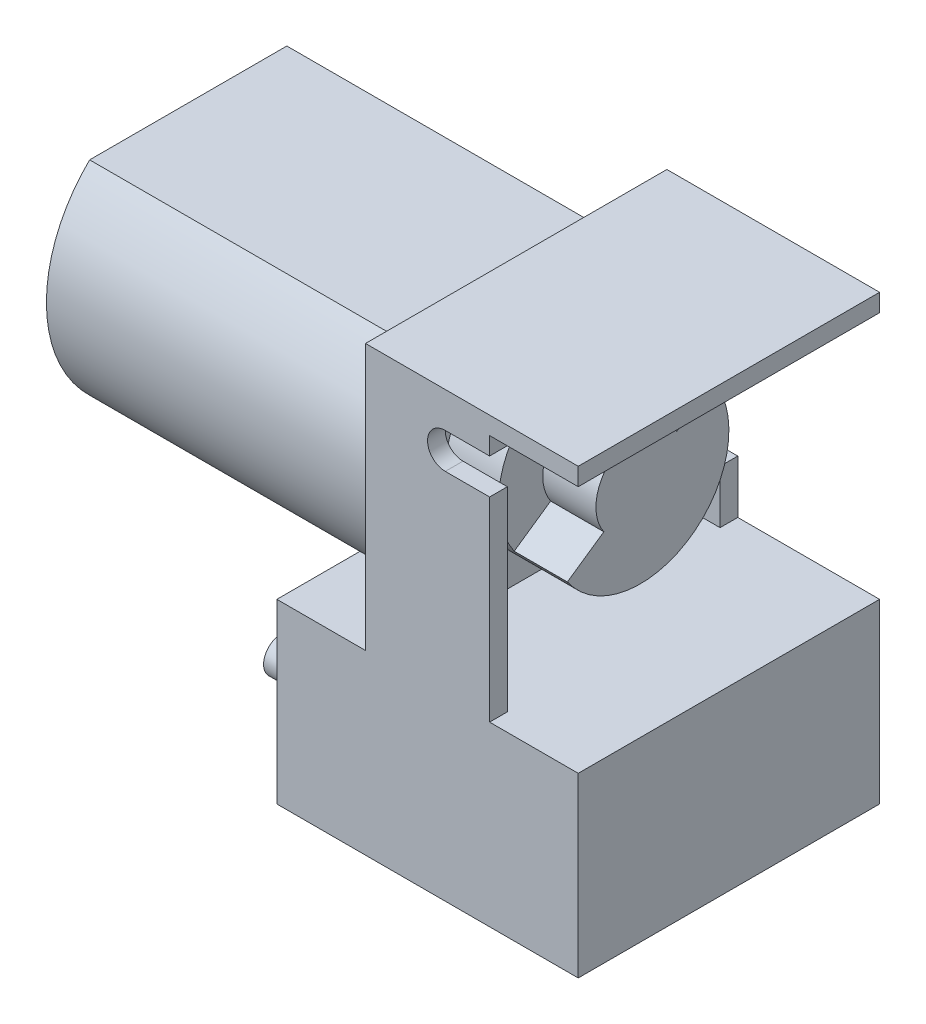
ISO-10303-21;
HEADER;
FILE_DESCRIPTION(('STEP AP214'),'2;1');
FILE_NAME('part.step','',(''),(''),'','','');
FILE_SCHEMA(('AUTOMOTIVE_DESIGN { 1 0 10303 214 1 1 1 1 }'));
ENDSEC;
DATA;
#1=APPLICATION_CONTEXT('core data for automotive mechanical design processes');
#2=APPLICATION_PROTOCOL_DEFINITION('international standard','automotive_design',2000,#1);
#3=PRODUCT_CONTEXT('',#1,'mechanical');
#4=PRODUCT('Part','Part','',(#3));
#5=PRODUCT_RELATED_PRODUCT_CATEGORY('part','',(#4));
#6=PRODUCT_DEFINITION_FORMATION('','',#4);
#7=PRODUCT_DEFINITION_CONTEXT('part definition',#1,'design');
#8=PRODUCT_DEFINITION('design','',#6,#7);
#9=PRODUCT_DEFINITION_SHAPE('','',#8);
#10=(LENGTH_UNIT() NAMED_UNIT(*) SI_UNIT(.MILLI.,.METRE.));
#11=(NAMED_UNIT(*) PLANE_ANGLE_UNIT() SI_UNIT($,.RADIAN.));
#12=(NAMED_UNIT(*) SI_UNIT($,.STERADIAN.) SOLID_ANGLE_UNIT());
#13=UNCERTAINTY_MEASURE_WITH_UNIT(LENGTH_MEASURE(1.E-05),#10,'distance_accuracy_value','');
#14=(GEOMETRIC_REPRESENTATION_CONTEXT(3) GLOBAL_UNCERTAINTY_ASSIGNED_CONTEXT((#13)) GLOBAL_UNIT_ASSIGNED_CONTEXT((#10,
#11,#12)) REPRESENTATION_CONTEXT('',''));
#15=CARTESIAN_POINT('',(0.,0.,0.));
#16=DIRECTION('',(0.,0.,1.));
#17=DIRECTION('',(1.,0.,0.));
#18=AXIS2_PLACEMENT_3D('',#15,#16,#17);
#19=CARTESIAN_POINT('',(-3.5,20.,8.5));
#20=DIRECTION('',(1.,0.,0.));
#21=DIRECTION('',(0.,1.,0.));
#22=AXIS2_PLACEMENT_3D('',#19,#20,#21);
#23=PLANE('',#22);
#24=DIRECTION('',(0.,-1.,0.));
#25=VECTOR('',#24,1.);
#26=CARTESIAN_POINT('',(-3.5,20.,-8.5));
#27=LINE('',#26,#25);
#28=CARTESIAN_POINT('',(-3.5,20.,-8.5));
#29=VERTEX_POINT('',#28);
#30=CARTESIAN_POINT('',(-3.5,5.,-8.5));
#31=VERTEX_POINT('',#30);
#32=EDGE_CURVE('E386',#29,#31,#27,.T.);
#33=ORIENTED_EDGE('',*,*,#32,.T.);
#34=DIRECTION('',(0.,0.,-1.));
#35=VECTOR('',#34,1.);
#36=CARTESIAN_POINT('',(-3.5,5.,8.5));
#37=LINE('',#36,#35);
#38=CARTESIAN_POINT('',(-3.5,5.,8.5));
#39=VERTEX_POINT('',#38);
#40=EDGE_CURVE('E401',#39,#31,#37,.T.);
#41=ORIENTED_EDGE('',*,*,#40,.F.);
#42=DIRECTION('',(0.,-1.,0.));
#43=VECTOR('',#42,1.);
#44=CARTESIAN_POINT('',(-3.5,20.,8.5));
#45=LINE('',#44,#43);
#46=CARTESIAN_POINT('',(-3.5,20.,8.5));
#47=VERTEX_POINT('',#46);
#48=EDGE_CURVE('E365',#47,#39,#45,.T.);
#49=ORIENTED_EDGE('',*,*,#48,.F.);
#50=DIRECTION('',(0.,0.,-1.));
#51=VECTOR('',#50,1.);
#52=CARTESIAN_POINT('',(-3.5,20.,8.5));
#53=LINE('',#52,#51);
#54=EDGE_CURVE('E404',#47,#29,#53,.T.);
#55=ORIENTED_EDGE('',*,*,#54,.T.);
#56=EDGE_LOOP('',(#33,#41,#49,#55));
#57=FACE_BOUND('',#56,.T.);
#58=CARTESIAN_POINT('',(-3.5,12.5,0.));
#59=DIRECTION('',(-1.,0.,0.));
#60=DIRECTION('',(0.,-1.,0.));
#61=AXIS2_PLACEMENT_3D('',#58,#59,#60);
#62=CIRCLE('',#61,8.);
#63=CARTESIAN_POINT('',(-3.5,18.25,-5.56214886532174));
#64=VERTEX_POINT('',#63);
#65=CARTESIAN_POINT('',(-3.5,6.75,-5.56214886532175));
#66=VERTEX_POINT('',#65);
#67=EDGE_CURVE('E248',#64,#66,#62,.T.);
#68=ORIENTED_EDGE('',*,*,#67,.F.);
#69=DIRECTION('',(0.,0.,-1.));
#70=VECTOR('',#69,1.);
#71=CARTESIAN_POINT('',(-3.5,18.25,-5.56214886532174));
#72=LINE('',#71,#70);
#73=CARTESIAN_POINT('',(-3.5,18.25,5.56214886532174));
#74=VERTEX_POINT('',#73);
#75=EDGE_CURVE('E257',#74,#64,#72,.T.);
#76=ORIENTED_EDGE('',*,*,#75,.F.);
#77=CARTESIAN_POINT('',(-3.5,12.5,0.));
#78=DIRECTION('',(-1.,0.,0.));
#79=DIRECTION('',(0.,-1.,0.));
#80=AXIS2_PLACEMENT_3D('',#77,#78,#79);
#81=CIRCLE('',#80,8.);
#82=CARTESIAN_POINT('',(-3.5,6.75,5.56214886532175));
#83=VERTEX_POINT('',#82);
#84=EDGE_CURVE('E267',#83,#74,#81,.T.);
#85=ORIENTED_EDGE('',*,*,#84,.F.);
#86=DIRECTION('',(0.,0.,1.));
#87=VECTOR('',#86,1.);
#88=CARTESIAN_POINT('',(-3.5,6.75,5.56214886532175));
#89=LINE('',#88,#87);
#90=EDGE_CURVE('E62',#66,#83,#89,.T.);
#91=ORIENTED_EDGE('',*,*,#90,.F.);
#92=EDGE_LOOP('',(#68,#76,#85,#91));
#93=FACE_BOUND('',#92,.T.);
#94=ADVANCED_FACE('F39',(#57,#93),#23,.F.);
#95=CARTESIAN_POINT('',(8.5,-5.,8.5));
#96=DIRECTION('',(-1.,0.,0.));
#97=DIRECTION('',(0.,0.,1.));
#98=AXIS2_PLACEMENT_3D('',#95,#96,#97);
#99=PLANE('',#98);
#100=DIRECTION('',(0.,1.,0.));
#101=VECTOR('',#100,1.);
#102=CARTESIAN_POINT('',(8.5,-5.,-8.5));
#103=LINE('',#102,#101);
#104=CARTESIAN_POINT('',(8.5,-5.,-8.5));
#105=VERTEX_POINT('',#104);
#106=CARTESIAN_POINT('',(8.5,5.,-8.5));
#107=VERTEX_POINT('',#106);
#108=EDGE_CURVE('E342',#105,#107,#103,.T.);
#109=ORIENTED_EDGE('',*,*,#108,.T.);
#110=DIRECTION('',(0.,0.,-1.));
#111=VECTOR('',#110,1.);
#112=CARTESIAN_POINT('',(8.5,5.,8.5));
#113=LINE('',#112,#111);
#114=CARTESIAN_POINT('',(8.5,5.,8.5));
#115=VERTEX_POINT('',#114);
#116=EDGE_CURVE('E430',#115,#107,#113,.T.);
#117=ORIENTED_EDGE('',*,*,#116,.F.);
#118=DIRECTION('',(0.,1.,0.));
#119=VECTOR('',#118,1.);
#120=CARTESIAN_POINT('',(8.5,-5.,8.5));
#121=LINE('',#120,#119);
#122=CARTESIAN_POINT('',(8.5,-5.,8.5));
#123=VERTEX_POINT('',#122);
#124=EDGE_CURVE('E343',#123,#115,#121,.T.);
#125=ORIENTED_EDGE('',*,*,#124,.F.);
#126=DIRECTION('',(0.,0.,-1.));
#127=VECTOR('',#126,1.);
#128=CARTESIAN_POINT('',(8.5,-5.,8.5));
#129=LINE('',#128,#127);
#130=EDGE_CURVE('E373',#123,#105,#129,.T.);
#131=ORIENTED_EDGE('',*,*,#130,.T.);
#132=EDGE_LOOP('',(#109,#117,#125,#131));
#133=FACE_BOUND('',#132,.T.);
#134=ADVANCED_FACE('F41',(#133),#99,.F.);
#135=CARTESIAN_POINT('',(8.5,5.,8.5));
#136=DIRECTION('',(0.,-1.,0.));
#137=DIRECTION('',(1.,0.,0.));
#138=AXIS2_PLACEMENT_3D('',#135,#136,#137);
#139=PLANE('',#138);
#140=DIRECTION('',(-1.,0.,0.));
#141=VECTOR('',#140,1.);
#142=CARTESIAN_POINT('',(8.5,5.,-8.5));
#143=LINE('',#142,#141);
#144=CARTESIAN_POINT('',(0.500000000000002,5.,-8.5));
#145=VERTEX_POINT('',#144);
#146=EDGE_CURVE('E376',#107,#145,#143,.T.);
#147=ORIENTED_EDGE('',*,*,#146,.T.);
#148=DIRECTION('',(0.,0.,-1.));
#149=VECTOR('',#148,1.);
#150=CARTESIAN_POINT('',(0.500000000000002,5.,-7.5));
#151=LINE('',#150,#149);
#152=CARTESIAN_POINT('',(0.500000000000002,5.,-7.5));
#153=VERTEX_POINT('',#152);
#154=EDGE_CURVE('E306',#153,#145,#151,.T.);
#155=ORIENTED_EDGE('',*,*,#154,.F.);
#156=DIRECTION('',(-1.,0.,0.));
#157=VECTOR('',#156,1.);
#158=CARTESIAN_POINT('',(-2.5,5.,-7.5));
#159=LINE('',#158,#157);
#160=CARTESIAN_POINT('',(-2.5,5.,-7.5));
#161=VERTEX_POINT('',#160);
#162=EDGE_CURVE('E298',#153,#161,#159,.T.);
#163=ORIENTED_EDGE('',*,*,#162,.T.);
#164=DIRECTION('',(0.,0.,1.));
#165=VECTOR('',#164,1.);
#166=CARTESIAN_POINT('',(-2.5,5.,7.5));
#167=LINE('',#166,#165);
#168=CARTESIAN_POINT('',(-2.5,5.,7.5));
#169=VERTEX_POINT('',#168);
#170=EDGE_CURVE('E322',#161,#169,#167,.T.);
#171=ORIENTED_EDGE('',*,*,#170,.T.);
#172=DIRECTION('',(1.,0.,0.));
#173=VECTOR('',#172,1.);
#174=CARTESIAN_POINT('',(-24.7602916254693,5.,7.5));
#175=LINE('',#174,#173);
#176=CARTESIAN_POINT('',(3.5,5.,7.5));
#177=VERTEX_POINT('',#176);
#178=EDGE_CURVE('E308',#169,#177,#175,.T.);
#179=ORIENTED_EDGE('',*,*,#178,.T.);
#180=DIRECTION('',(0.,0.,-1.));
#181=VECTOR('',#180,1.);
#182=CARTESIAN_POINT('',(3.5,5.,8.5));
#183=LINE('',#182,#181);
#184=CARTESIAN_POINT('',(3.5,5.,8.5));
#185=VERTEX_POINT('',#184);
#186=EDGE_CURVE('E427',#185,#177,#183,.T.);
#187=ORIENTED_EDGE('',*,*,#186,.F.);
#188=DIRECTION('',(-1.,0.,0.));
#189=VECTOR('',#188,1.);
#190=CARTESIAN_POINT('',(8.5,5.,8.5));
#191=LINE('',#190,#189);
#192=EDGE_CURVE('E346',#115,#185,#191,.T.);
#193=ORIENTED_EDGE('',*,*,#192,.F.);
#194=ORIENTED_EDGE('',*,*,#116,.T.);
#195=EDGE_LOOP('',(#147,#155,#163,#171,#179,#187,#193,#194));
#196=FACE_BOUND('',#195,.T.);
#197=ADVANCED_FACE('F503',(#196),#139,.F.);
#198=CARTESIAN_POINT('',(3.5,5.,8.5));
#199=DIRECTION('',(-1.,0.,0.));
#200=DIRECTION('',(0.,-1.,0.));
#201=AXIS2_PLACEMENT_3D('',#198,#199,#200);
#202=PLANE('',#201);
#203=ORIENTED_EDGE('',*,*,#186,.T.);
#204=DIRECTION('',(0.,1.,0.));
#205=VECTOR('',#204,1.);
#206=CARTESIAN_POINT('',(3.5,5.,7.5));
#207=LINE('',#206,#205);
#208=CARTESIAN_POINT('',(3.5,16.,7.5));
#209=VERTEX_POINT('',#208);
#210=EDGE_CURVE('E339',#177,#209,#207,.T.);
#211=ORIENTED_EDGE('',*,*,#210,.T.);
#212=DIRECTION('',(0.,0.,-1.));
#213=VECTOR('',#212,1.);
#214=CARTESIAN_POINT('',(3.5,16.,8.5));
#215=LINE('',#214,#213);
#216=CARTESIAN_POINT('',(3.5,16.,8.5));
#217=VERTEX_POINT('',#216);
#218=EDGE_CURVE('E424',#217,#209,#215,.T.);
#219=ORIENTED_EDGE('',*,*,#218,.F.);
#220=DIRECTION('',(0.,1.,0.));
#221=VECTOR('',#220,1.);
#222=CARTESIAN_POINT('',(3.5,5.,8.5));
#223=LINE('',#222,#221);
#224=EDGE_CURVE('E349',#185,#217,#223,.T.);
#225=ORIENTED_EDGE('',*,*,#224,.F.);
#226=EDGE_LOOP('',(#203,#211,#219,#225));
#227=FACE_BOUND('',#226,.T.);
#228=ADVANCED_FACE('F508',(#227),#202,.F.);
#229=CARTESIAN_POINT('',(3.5,16.,8.5));
#230=DIRECTION('',(0.,-1.,0.));
#231=DIRECTION('',(1.,0.,0.));
#232=AXIS2_PLACEMENT_3D('',#229,#230,#231);
#233=PLANE('',#232);
#234=ORIENTED_EDGE('',*,*,#218,.T.);
#235=DIRECTION('',(-1.,0.,0.));
#236=VECTOR('',#235,1.);
#237=CARTESIAN_POINT('',(3.5,16.,7.5));
#238=LINE('',#237,#236);
#239=CARTESIAN_POINT('',(1.,16.,7.5));
#240=VERTEX_POINT('',#239);
#241=EDGE_CURVE('E336',#209,#240,#238,.T.);
#242=ORIENTED_EDGE('',*,*,#241,.T.);
#243=DIRECTION('',(0.,0.,-1.));
#244=VECTOR('',#243,1.);
#245=CARTESIAN_POINT('',(1.,16.,8.5));
#246=LINE('',#245,#244);
#247=CARTESIAN_POINT('',(1.,16.,8.5));
#248=VERTEX_POINT('',#247);
#249=EDGE_CURVE('E421',#248,#240,#246,.T.);
#250=ORIENTED_EDGE('',*,*,#249,.F.);
#251=DIRECTION('',(-1.,0.,0.));
#252=VECTOR('',#251,1.);
#253=CARTESIAN_POINT('',(3.5,16.,8.5));
#254=LINE('',#253,#252);
#255=EDGE_CURVE('E351',#217,#248,#254,.T.);
#256=ORIENTED_EDGE('',*,*,#255,.F.);
#257=EDGE_LOOP('',(#234,#242,#250,#256));
#258=FACE_BOUND('',#257,.T.);
#259=ADVANCED_FACE('F514',(#258),#233,.F.);
#260=CARTESIAN_POINT('',(1.,17.,8.5));
#261=DIRECTION('',(0.,0.,-1.));
#262=DIRECTION('',(-1.,0.,0.));
#263=AXIS2_PLACEMENT_3D('',#260,#261,#262);
#264=CYLINDRICAL_SURFACE('',#263,0.999999999999999);
#265=ORIENTED_EDGE('',*,*,#249,.T.);
#266=CARTESIAN_POINT('',(1.,17.,7.5));
#267=DIRECTION('',(0.,0.,1.));
#268=DIRECTION('',(0.,-1.,0.));
#269=AXIS2_PLACEMENT_3D('',#266,#267,#268);
#270=CIRCLE('',#269,0.999999999999999);
#271=CARTESIAN_POINT('',(1.,18.,7.5));
#272=VERTEX_POINT('',#271);
#273=EDGE_CURVE('E333',#240,#272,#270,.F.);
#274=ORIENTED_EDGE('',*,*,#273,.T.);
#275=DIRECTION('',(0.,0.,-1.));
#276=VECTOR('',#275,1.);
#277=CARTESIAN_POINT('',(1.,18.,8.5));
#278=LINE('',#277,#276);
#279=CARTESIAN_POINT('',(1.,18.,8.5));
#280=VERTEX_POINT('',#279);
#281=EDGE_CURVE('E418',#280,#272,#278,.T.);
#282=ORIENTED_EDGE('',*,*,#281,.F.);
#283=CARTESIAN_POINT('',(1.,17.,8.5));
#284=DIRECTION('',(0.,0.,-1.));
#285=DIRECTION('',(-1.,0.,0.));
#286=AXIS2_PLACEMENT_3D('',#283,#284,#285);
#287=CIRCLE('',#286,0.999999999999999);
#288=EDGE_CURVE('E353',#248,#280,#287,.T.);
#289=ORIENTED_EDGE('',*,*,#288,.F.);
#290=EDGE_LOOP('',(#265,#274,#282,#289));
#291=FACE_BOUND('',#290,.T.);
#292=ADVANCED_FACE('F516',(#291),#264,.F.);
#293=CARTESIAN_POINT('',(1.,18.,8.5));
#294=DIRECTION('',(0.,1.,0.));
#295=DIRECTION('',(0.,0.,1.));
#296=AXIS2_PLACEMENT_3D('',#293,#294,#295);
#297=PLANE('',#296);
#298=ORIENTED_EDGE('',*,*,#281,.T.);
#299=DIRECTION('',(1.,0.,0.));
#300=VECTOR('',#299,1.);
#301=CARTESIAN_POINT('',(1.,18.,7.5));
#302=LINE('',#301,#300);
#303=CARTESIAN_POINT('',(3.5,18.,7.5));
#304=VERTEX_POINT('',#303);
#305=EDGE_CURVE('E330',#272,#304,#302,.T.);
#306=ORIENTED_EDGE('',*,*,#305,.T.);
#307=DIRECTION('',(0.,0.,-1.));
#308=VECTOR('',#307,1.);
#309=CARTESIAN_POINT('',(3.5,18.,8.5));
#310=LINE('',#309,#308);
#311=CARTESIAN_POINT('',(3.5,18.,8.5));
#312=VERTEX_POINT('',#311);
#313=EDGE_CURVE('E415',#312,#304,#310,.T.);
#314=ORIENTED_EDGE('',*,*,#313,.F.);
#315=DIRECTION('',(1.,0.,0.));
#316=VECTOR('',#315,1.);
#317=CARTESIAN_POINT('',(1.,18.,8.5));
#318=LINE('',#317,#316);
#319=EDGE_CURVE('E355',#280,#312,#318,.T.);
#320=ORIENTED_EDGE('',*,*,#319,.F.);
#321=EDGE_LOOP('',(#298,#306,#314,#320));
#322=FACE_BOUND('',#321,.T.);
#323=ADVANCED_FACE('F520',(#322),#297,.F.);
#324=CARTESIAN_POINT('',(3.5,18.,8.5));
#325=DIRECTION('',(-1.,0.,0.));
#326=DIRECTION('',(0.,0.,1.));
#327=AXIS2_PLACEMENT_3D('',#324,#325,#326);
#328=PLANE('',#327);
#329=ORIENTED_EDGE('',*,*,#313,.T.);
#330=DIRECTION('',(0.,1.,0.));
#331=VECTOR('',#330,1.);
#332=CARTESIAN_POINT('',(3.5,18.,7.5));
#333=LINE('',#332,#331);
#334=CARTESIAN_POINT('',(3.5,19.,7.5));
#335=VERTEX_POINT('',#334);
#336=EDGE_CURVE('E327',#304,#335,#333,.T.);
#337=ORIENTED_EDGE('',*,*,#336,.T.);
#338=DIRECTION('',(0.,0.,-1.));
#339=VECTOR('',#338,1.);
#340=CARTESIAN_POINT('',(3.5,19.,8.5));
#341=LINE('',#340,#339);
#342=CARTESIAN_POINT('',(3.5,19.,8.5));
#343=VERTEX_POINT('',#342);
#344=EDGE_CURVE('E412',#343,#335,#341,.T.);
#345=ORIENTED_EDGE('',*,*,#344,.F.);
#346=DIRECTION('',(0.,1.,0.));
#347=VECTOR('',#346,1.);
#348=CARTESIAN_POINT('',(3.5,18.,8.5));
#349=LINE('',#348,#347);
#350=EDGE_CURVE('E357',#312,#343,#349,.T.);
#351=ORIENTED_EDGE('',*,*,#350,.F.);
#352=EDGE_LOOP('',(#329,#337,#345,#351));
#353=FACE_BOUND('',#352,.T.);
#354=ADVANCED_FACE('F525',(#353),#328,.F.);
#355=CARTESIAN_POINT('',(3.5,19.,8.5));
#356=DIRECTION('',(0.,1.,0.));
#357=DIRECTION('',(0.,0.,1.));
#358=AXIS2_PLACEMENT_3D('',#355,#356,#357);
#359=PLANE('',#358);
#360=ORIENTED_EDGE('',*,*,#344,.T.);
#361=DIRECTION('',(1.,0.,0.));
#362=VECTOR('',#361,1.);
#363=CARTESIAN_POINT('',(-24.7602916254693,19.,7.5));
#364=LINE('',#363,#362);
#365=CARTESIAN_POINT('',(-2.5,19.,7.5));
#366=VERTEX_POINT('',#365);
#367=EDGE_CURVE('E317',#366,#335,#364,.T.);
#368=ORIENTED_EDGE('',*,*,#367,.F.);
#369=DIRECTION('',(0.,0.,-1.));
#370=VECTOR('',#369,1.);
#371=CARTESIAN_POINT('',(-2.5,19.,7.5));
#372=LINE('',#371,#370);
#373=CARTESIAN_POINT('',(-2.5,19.,-8.5));
#374=VERTEX_POINT('',#373);
#375=EDGE_CURVE('E316',#366,#374,#372,.T.);
#376=ORIENTED_EDGE('',*,*,#375,.T.);
#377=DIRECTION('',(1.,0.,0.));
#378=VECTOR('',#377,1.);
#379=CARTESIAN_POINT('',(3.5,19.,-8.5));
#380=LINE('',#379,#378);
#381=CARTESIAN_POINT('',(8.5,19.,-8.5));
#382=VERTEX_POINT('',#381);
#383=EDGE_CURVE('E379',#374,#382,#380,.T.);
#384=ORIENTED_EDGE('',*,*,#383,.T.);
#385=DIRECTION('',(0.,0.,-1.));
#386=VECTOR('',#385,1.);
#387=CARTESIAN_POINT('',(8.5,19.,8.5));
#388=LINE('',#387,#386);
#389=CARTESIAN_POINT('',(8.5,19.,8.5));
#390=VERTEX_POINT('',#389);
#391=EDGE_CURVE('E410',#390,#382,#388,.T.);
#392=ORIENTED_EDGE('',*,*,#391,.F.);
#393=DIRECTION('',(1.,0.,0.));
#394=VECTOR('',#393,1.);
#395=CARTESIAN_POINT('',(3.5,19.,8.5));
#396=LINE('',#395,#394);
#397=EDGE_CURVE('E359',#343,#390,#396,.T.);
#398=ORIENTED_EDGE('',*,*,#397,.F.);
#399=EDGE_LOOP('',(#360,#368,#376,#384,#392,#398));
#400=FACE_BOUND('',#399,.T.);
#401=ADVANCED_FACE('F486',(#400),#359,.F.);
#402=CARTESIAN_POINT('',(8.5,19.,8.5));
#403=DIRECTION('',(-1.,0.,0.));
#404=DIRECTION('',(0.,0.,1.));
#405=AXIS2_PLACEMENT_3D('',#402,#403,#404);
#406=PLANE('',#405);
#407=DIRECTION('',(0.,1.,0.));
#408=VECTOR('',#407,1.);
#409=CARTESIAN_POINT('',(8.5,19.,-8.5));
#410=LINE('',#409,#408);
#411=CARTESIAN_POINT('',(8.5,20.,-8.5));
#412=VERTEX_POINT('',#411);
#413=EDGE_CURVE('E382',#382,#412,#410,.T.);
#414=ORIENTED_EDGE('',*,*,#413,.T.);
#415=DIRECTION('',(0.,0.,-1.));
#416=VECTOR('',#415,1.);
#417=CARTESIAN_POINT('',(8.5,20.,8.5));
#418=LINE('',#417,#416);
#419=CARTESIAN_POINT('',(8.5,20.,8.5));
#420=VERTEX_POINT('',#419);
#421=EDGE_CURVE('E407',#420,#412,#418,.T.);
#422=ORIENTED_EDGE('',*,*,#421,.F.);
#423=DIRECTION('',(0.,1.,0.));
#424=VECTOR('',#423,1.);
#425=CARTESIAN_POINT('',(8.5,19.,8.5));
#426=LINE('',#425,#424);
#427=EDGE_CURVE('E361',#390,#420,#426,.T.);
#428=ORIENTED_EDGE('',*,*,#427,.F.);
#429=ORIENTED_EDGE('',*,*,#391,.T.);
#430=EDGE_LOOP('',(#414,#422,#428,#429));
#431=FACE_BOUND('',#430,.T.);
#432=ADVANCED_FACE('F480',(#431),#406,.F.);
#433=CARTESIAN_POINT('',(8.5,20.,8.5));
#434=DIRECTION('',(0.,-1.,0.));
#435=DIRECTION('',(0.,0.,-1.));
#436=AXIS2_PLACEMENT_3D('',#433,#434,#435);
#437=PLANE('',#436);
#438=DIRECTION('',(-1.,0.,0.));
#439=VECTOR('',#438,1.);
#440=CARTESIAN_POINT('',(8.5,20.,-8.5));
#441=LINE('',#440,#439);
#442=EDGE_CURVE('E384',#412,#29,#441,.T.);
#443=ORIENTED_EDGE('',*,*,#442,.T.);
#444=ORIENTED_EDGE('',*,*,#54,.F.);
#445=DIRECTION('',(-1.,0.,0.));
#446=VECTOR('',#445,1.);
#447=CARTESIAN_POINT('',(8.5,20.,8.5));
#448=LINE('',#447,#446);
#449=EDGE_CURVE('E363',#420,#47,#448,.T.);
#450=ORIENTED_EDGE('',*,*,#449,.F.);
#451=ORIENTED_EDGE('',*,*,#421,.T.);
#452=EDGE_LOOP('',(#443,#444,#450,#451));
#453=FACE_BOUND('',#452,.T.);
#454=ADVANCED_FACE('F476',(#453),#437,.F.);
#455=CARTESIAN_POINT('',(-3.5,5.,8.5));
#456=DIRECTION('',(0.,-1.,0.));
#457=DIRECTION('',(1.,0.,0.));
#458=AXIS2_PLACEMENT_3D('',#455,#456,#457);
#459=PLANE('',#458);
#460=DIRECTION('',(-1.,0.,0.));
#461=VECTOR('',#460,1.);
#462=CARTESIAN_POINT('',(-3.5,5.,-8.5));
#463=LINE('',#462,#461);
#464=CARTESIAN_POINT('',(-8.5,5.,-8.5));
#465=VERTEX_POINT('',#464);
#466=EDGE_CURVE('E388',#31,#465,#463,.T.);
#467=ORIENTED_EDGE('',*,*,#466,.T.);
#468=DIRECTION('',(0.,0.,-1.));
#469=VECTOR('',#468,1.);
#470=CARTESIAN_POINT('',(-8.5,5.,8.5));
#471=LINE('',#470,#469);
#472=CARTESIAN_POINT('',(-8.5,5.,8.5));
#473=VERTEX_POINT('',#472);
#474=EDGE_CURVE('E398',#473,#465,#471,.T.);
#475=ORIENTED_EDGE('',*,*,#474,.F.);
#476=DIRECTION('',(-1.,0.,0.));
#477=VECTOR('',#476,1.);
#478=CARTESIAN_POINT('',(-3.5,5.,8.5));
#479=LINE('',#478,#477);
#480=EDGE_CURVE('E367',#39,#473,#479,.T.);
#481=ORIENTED_EDGE('',*,*,#480,.F.);
#482=ORIENTED_EDGE('',*,*,#40,.T.);
#483=EDGE_LOOP('',(#467,#475,#481,#482));
#484=FACE_BOUND('',#483,.T.);
#485=ADVANCED_FACE('F440',(#484),#459,.F.);
#486=CARTESIAN_POINT('',(-8.5,5.,8.5));
#487=DIRECTION('',(1.,0.,0.));
#488=DIRECTION('',(0.,0.,-1.));
#489=AXIS2_PLACEMENT_3D('',#486,#487,#488);
#490=PLANE('',#489);
#491=CARTESIAN_POINT('',(-8.5,-2.30182699478,3.75));
#492=DIRECTION('',(1.,0.,0.));
#493=DIRECTION('',(0.,0.,-1.));
#494=AXIS2_PLACEMENT_3D('',#491,#492,#493);
#495=CIRCLE('',#494,1.);
#496=CARTESIAN_POINT('',(-8.5,-2.30182699478,2.75));
#497=VERTEX_POINT('',#496);
#498=EDGE_CURVE('E12',#497,#497,#495,.F.);
#499=ORIENTED_EDGE('',*,*,#498,.F.);
#500=EDGE_LOOP('',(#499));
#501=FACE_BOUND('',#500,.T.);
#502=CARTESIAN_POINT('',(-8.5,-2.30182699478,-3.75));
#503=DIRECTION('',(1.,0.,0.));
#504=DIRECTION('',(0.,0.,-1.));
#505=AXIS2_PLACEMENT_3D('',#502,#503,#504);
#506=CIRCLE('',#505,1.);
#507=CARTESIAN_POINT('',(-8.5,-2.30182699478,-4.75));
#508=VERTEX_POINT('',#507);
#509=EDGE_CURVE('E47',#508,#508,#506,.F.);
#510=ORIENTED_EDGE('',*,*,#509,.F.);
#511=EDGE_LOOP('',(#510));
#512=FACE_BOUND('',#511,.T.);
#513=DIRECTION('',(0.,-1.,0.));
#514=VECTOR('',#513,1.);
#515=CARTESIAN_POINT('',(-8.5,5.,-8.5));
#516=LINE('',#515,#514);
#517=CARTESIAN_POINT('',(-8.5,-5.,-8.5));
#518=VERTEX_POINT('',#517);
#519=EDGE_CURVE('E390',#465,#518,#516,.T.);
#520=ORIENTED_EDGE('',*,*,#519,.T.);
#521=DIRECTION('',(0.,0.,-1.));
#522=VECTOR('',#521,1.);
#523=CARTESIAN_POINT('',(-8.5,-5.,8.5));
#524=LINE('',#523,#522);
#525=CARTESIAN_POINT('',(-8.5,-5.,8.5));
#526=VERTEX_POINT('',#525);
#527=EDGE_CURVE('E395',#526,#518,#524,.T.);
#528=ORIENTED_EDGE('',*,*,#527,.F.);
#529=DIRECTION('',(0.,-1.,0.));
#530=VECTOR('',#529,1.);
#531=CARTESIAN_POINT('',(-8.5,5.,8.5));
#532=LINE('',#531,#530);
#533=EDGE_CURVE('E369',#473,#526,#532,.T.);
#534=ORIENTED_EDGE('',*,*,#533,.F.);
#535=ORIENTED_EDGE('',*,*,#474,.T.);
#536=EDGE_LOOP('',(#520,#528,#534,#535));
#537=FACE_BOUND('',#536,.T.);
#538=ADVANCED_FACE('F436',(#501,#512,#537),#490,.F.);
#539=CARTESIAN_POINT('',(-8.5,-5.,8.5));
#540=DIRECTION('',(0.,1.,0.));
#541=DIRECTION('',(0.,0.,1.));
#542=AXIS2_PLACEMENT_3D('',#539,#540,#541);
#543=PLANE('',#542);
#544=DIRECTION('',(1.,0.,0.));
#545=VECTOR('',#544,1.);
#546=CARTESIAN_POINT('',(-8.5,-5.,-8.5));
#547=LINE('',#546,#545);
#548=EDGE_CURVE('E347',#518,#105,#547,.T.);
#549=ORIENTED_EDGE('',*,*,#548,.T.);
#550=ORIENTED_EDGE('',*,*,#130,.F.);
#551=DIRECTION('',(1.,0.,0.));
#552=VECTOR('',#551,1.);
#553=CARTESIAN_POINT('',(-8.5,-5.,8.5));
#554=LINE('',#553,#552);
#555=EDGE_CURVE('E371',#526,#123,#554,.T.);
#556=ORIENTED_EDGE('',*,*,#555,.F.);
#557=ORIENTED_EDGE('',*,*,#527,.T.);
#558=EDGE_LOOP('',(#549,#550,#556,#557));
#559=FACE_BOUND('',#558,.T.);
#560=ADVANCED_FACE('F439',(#559),#543,.F.);
#561=CARTESIAN_POINT('',(1.,17.,8.5));
#562=DIRECTION('',(0.,0.,-1.));
#563=DIRECTION('',(-1.,0.,0.));
#564=AXIS2_PLACEMENT_3D('',#561,#562,#563);
#565=PLANE('',#564);
#566=ORIENTED_EDGE('',*,*,#124,.T.);
#567=ORIENTED_EDGE('',*,*,#192,.T.);
#568=ORIENTED_EDGE('',*,*,#224,.T.);
#569=ORIENTED_EDGE('',*,*,#255,.T.);
#570=ORIENTED_EDGE('',*,*,#288,.T.);
#571=ORIENTED_EDGE('',*,*,#319,.T.);
#572=ORIENTED_EDGE('',*,*,#350,.T.);
#573=ORIENTED_EDGE('',*,*,#397,.T.);
#574=ORIENTED_EDGE('',*,*,#427,.T.);
#575=ORIENTED_EDGE('',*,*,#449,.T.);
#576=ORIENTED_EDGE('',*,*,#48,.T.);
#577=ORIENTED_EDGE('',*,*,#480,.T.);
#578=ORIENTED_EDGE('',*,*,#533,.T.);
#579=ORIENTED_EDGE('',*,*,#555,.T.);
#580=EDGE_LOOP('',(#566,#567,#568,#569,#570,#571,#572,#573,#574,#575,#576,#577,#578,#579));
#581=FACE_BOUND('',#580,.T.);
#582=ADVANCED_FACE('F463',(#581),#565,.F.);
#583=CARTESIAN_POINT('',(1.,17.,-8.5));
#584=DIRECTION('',(0.,0.,-1.));
#585=DIRECTION('',(-1.,0.,0.));
#586=AXIS2_PLACEMENT_3D('',#583,#584,#585);
#587=PLANE('',#586);
#588=ORIENTED_EDGE('',*,*,#383,.F.);
#589=DIRECTION('',(0.,-1.,0.));
#590=VECTOR('',#589,1.);
#591=CARTESIAN_POINT('',(-2.5,19.,-8.5));
#592=LINE('',#591,#590);
#593=CARTESIAN_POINT('',(-2.5,8.,-8.5));
#594=VERTEX_POINT('',#593);
#595=EDGE_CURVE('E313',#374,#594,#592,.T.);
#596=ORIENTED_EDGE('',*,*,#595,.T.);
#597=DIRECTION('',(1.,0.,0.));
#598=VECTOR('',#597,1.);
#599=CARTESIAN_POINT('',(-2.5,8.,-8.5));
#600=LINE('',#599,#598);
#601=CARTESIAN_POINT('',(0.500000000000002,8.,-8.5));
#602=VERTEX_POINT('',#601);
#603=EDGE_CURVE('E286',#594,#602,#600,.T.);
#604=ORIENTED_EDGE('',*,*,#603,.T.);
#605=DIRECTION('',(0.,-1.,0.));
#606=VECTOR('',#605,1.);
#607=CARTESIAN_POINT('',(0.500000000000002,5.,-8.5));
#608=LINE('',#607,#606);
#609=EDGE_CURVE('E293',#602,#145,#608,.T.);
#610=ORIENTED_EDGE('',*,*,#609,.T.);
#611=ORIENTED_EDGE('',*,*,#146,.F.);
#612=ORIENTED_EDGE('',*,*,#108,.F.);
#613=ORIENTED_EDGE('',*,*,#548,.F.);
#614=ORIENTED_EDGE('',*,*,#519,.F.);
#615=ORIENTED_EDGE('',*,*,#466,.F.);
#616=ORIENTED_EDGE('',*,*,#32,.F.);
#617=ORIENTED_EDGE('',*,*,#442,.F.);
#618=ORIENTED_EDGE('',*,*,#413,.F.);
#619=EDGE_LOOP('',(#588,#596,#604,#610,#611,#612,#613,#614,#615,#616,#617,#618));
#620=FACE_BOUND('',#619,.T.);
#621=CARTESIAN_POINT('',(-0.999999999999998,6.5,-8.5));
#622=DIRECTION('',(0.,0.,-1.));
#623=DIRECTION('',(-1.,0.,0.));
#624=AXIS2_PLACEMENT_3D('',#621,#622,#623);
#625=CIRCLE('',#624,0.6);
#626=CARTESIAN_POINT('',(-1.6,6.5,-8.5));
#627=VERTEX_POINT('',#626);
#628=EDGE_CURVE('E282',#627,#627,#625,.T.);
#629=ORIENTED_EDGE('',*,*,#628,.F.);
#630=EDGE_LOOP('',(#629));
#631=FACE_BOUND('',#630,.T.);
#632=ADVANCED_FACE('F456',(#620,#631),#587,.T.);
#633=CARTESIAN_POINT('',(-24.7602916254693,19.,7.5));
#634=DIRECTION('',(0.,0.,1.));
#635=DIRECTION('',(0.,-1.,0.));
#636=AXIS2_PLACEMENT_3D('',#633,#634,#635);
#637=PLANE('',#636);
#638=ORIENTED_EDGE('',*,*,#178,.F.);
#639=DIRECTION('',(0.,1.,0.));
#640=VECTOR('',#639,1.);
#641=CARTESIAN_POINT('',(-2.5,19.,7.5));
#642=LINE('',#641,#640);
#643=EDGE_CURVE('E320',#169,#366,#642,.T.);
#644=ORIENTED_EDGE('',*,*,#643,.T.);
#645=ORIENTED_EDGE('',*,*,#367,.T.);
#646=ORIENTED_EDGE('',*,*,#336,.F.);
#647=ORIENTED_EDGE('',*,*,#305,.F.);
#648=ORIENTED_EDGE('',*,*,#273,.F.);
#649=ORIENTED_EDGE('',*,*,#241,.F.);
#650=ORIENTED_EDGE('',*,*,#210,.F.);
#651=EDGE_LOOP('',(#638,#644,#645,#646,#647,#648,#649,#650));
#652=FACE_BOUND('',#651,.T.);
#653=ADVANCED_FACE('F527',(#652),#637,.F.);
#654=CARTESIAN_POINT('',(-2.5,20.,8.5));
#655=DIRECTION('',(1.,0.,0.));
#656=DIRECTION('',(0.,1.,0.));
#657=AXIS2_PLACEMENT_3D('',#654,#655,#656);
#658=PLANE('',#657);
#659=CARTESIAN_POINT('',(-2.5,12.5,0.));
#660=DIRECTION('',(1.,0.,0.));
#661=DIRECTION('',(0.,1.,0.));
#662=AXIS2_PLACEMENT_3D('',#659,#660,#661);
#663=CIRCLE('',#662,5.);
#664=CARTESIAN_POINT('',(-2.5,17.5,0.));
#665=VERTEX_POINT('',#664);
#666=EDGE_CURVE('E249',#665,#665,#663,.T.);
#667=ORIENTED_EDGE('',*,*,#666,.F.);
#668=EDGE_LOOP('',(#667));
#669=FACE_BOUND('',#668,.T.);
#670=DIRECTION('',(0.,0.,-1.));
#671=VECTOR('',#670,1.);
#672=CARTESIAN_POINT('',(-2.5,8.,-7.5));
#673=LINE('',#672,#671);
#674=CARTESIAN_POINT('',(-2.5,8.,-7.5));
#675=VERTEX_POINT('',#674);
#676=EDGE_CURVE('E301',#675,#594,#673,.T.);
#677=ORIENTED_EDGE('',*,*,#676,.T.);
#678=ORIENTED_EDGE('',*,*,#595,.F.);
#679=ORIENTED_EDGE('',*,*,#375,.F.);
#680=ORIENTED_EDGE('',*,*,#643,.F.);
#681=ORIENTED_EDGE('',*,*,#170,.F.);
#682=DIRECTION('',(0.,1.,0.));
#683=VECTOR('',#682,1.);
#684=CARTESIAN_POINT('',(-2.5,5.,-7.5));
#685=LINE('',#684,#683);
#686=EDGE_CURVE('E289',#161,#675,#685,.T.);
#687=ORIENTED_EDGE('',*,*,#686,.T.);
#688=EDGE_LOOP('',(#677,#678,#679,#680,#681,#687));
#689=FACE_BOUND('',#688,.T.);
#690=ADVANCED_FACE('F489',(#669,#689),#658,.T.);
#691=CARTESIAN_POINT('',(0.500000000000002,5.,-7.5));
#692=DIRECTION('',(1.,0.,0.));
#693=DIRECTION('',(0.,0.,-1.));
#694=AXIS2_PLACEMENT_3D('',#691,#692,#693);
#695=PLANE('',#694);
#696=ORIENTED_EDGE('',*,*,#609,.F.);
#697=DIRECTION('',(0.,0.,-1.));
#698=VECTOR('',#697,1.);
#699=CARTESIAN_POINT('',(0.500000000000002,8.,-7.5));
#700=LINE('',#699,#698);
#701=CARTESIAN_POINT('',(0.500000000000002,8.,-7.5));
#702=VERTEX_POINT('',#701);
#703=EDGE_CURVE('E309',#702,#602,#700,.T.);
#704=ORIENTED_EDGE('',*,*,#703,.F.);
#705=DIRECTION('',(0.,-1.,0.));
#706=VECTOR('',#705,1.);
#707=CARTESIAN_POINT('',(0.500000000000002,5.,-7.5));
#708=LINE('',#707,#706);
#709=EDGE_CURVE('E296',#702,#153,#708,.T.);
#710=ORIENTED_EDGE('',*,*,#709,.T.);
#711=ORIENTED_EDGE('',*,*,#154,.T.);
#712=EDGE_LOOP('',(#696,#704,#710,#711));
#713=FACE_BOUND('',#712,.T.);
#714=ADVANCED_FACE('F501',(#713),#695,.T.);
#715=CARTESIAN_POINT('',(-2.5,8.,-7.5));
#716=DIRECTION('',(0.,1.,0.));
#717=DIRECTION('',(0.,0.,1.));
#718=AXIS2_PLACEMENT_3D('',#715,#716,#717);
#719=PLANE('',#718);
#720=ORIENTED_EDGE('',*,*,#603,.F.);
#721=ORIENTED_EDGE('',*,*,#676,.F.);
#722=DIRECTION('',(1.,0.,0.));
#723=VECTOR('',#722,1.);
#724=CARTESIAN_POINT('',(-2.5,8.,-7.5));
#725=LINE('',#724,#723);
#726=EDGE_CURVE('E292',#675,#702,#725,.T.);
#727=ORIENTED_EDGE('',*,*,#726,.T.);
#728=ORIENTED_EDGE('',*,*,#703,.T.);
#729=EDGE_LOOP('',(#720,#721,#727,#728));
#730=FACE_BOUND('',#729,.T.);
#731=ADVANCED_FACE('F493',(#730),#719,.T.);
#732=CARTESIAN_POINT('',(0.,0.,-7.5));
#733=DIRECTION('',(0.,0.,-1.));
#734=DIRECTION('',(-1.,0.,0.));
#735=AXIS2_PLACEMENT_3D('',#732,#733,#734);
#736=PLANE('',#735);
#737=CARTESIAN_POINT('',(-0.999999999999998,6.5,-7.5));
#738=DIRECTION('',(0.,0.,-1.));
#739=DIRECTION('',(-1.,0.,0.));
#740=AXIS2_PLACEMENT_3D('',#737,#738,#739);
#741=CIRCLE('',#740,0.6);
#742=CARTESIAN_POINT('',(-1.6,6.5,-7.5));
#743=VERTEX_POINT('',#742);
#744=EDGE_CURVE('E283',#743,#743,#741,.T.);
#745=ORIENTED_EDGE('',*,*,#744,.T.);
#746=EDGE_LOOP('',(#745));
#747=FACE_BOUND('',#746,.T.);
#748=ORIENTED_EDGE('',*,*,#686,.F.);
#749=ORIENTED_EDGE('',*,*,#162,.F.);
#750=ORIENTED_EDGE('',*,*,#709,.F.);
#751=ORIENTED_EDGE('',*,*,#726,.F.);
#752=EDGE_LOOP('',(#748,#749,#750,#751));
#753=FACE_BOUND('',#752,.T.);
#754=ADVANCED_FACE('F496',(#747,#753),#736,.F.);
#755=CARTESIAN_POINT('',(-0.999999999999998,6.5,-7.5));
#756=DIRECTION('',(0.,0.,-1.));
#757=DIRECTION('',(-1.,0.,0.));
#758=AXIS2_PLACEMENT_3D('',#755,#756,#757);
#759=CYLINDRICAL_SURFACE('',#758,0.6);
#760=ORIENTED_EDGE('',*,*,#744,.F.);
#761=EDGE_LOOP('',(#760));
#762=FACE_BOUND('',#761,.T.);
#763=ORIENTED_EDGE('',*,*,#628,.T.);
#764=EDGE_LOOP('',(#763));
#765=FACE_BOUND('',#764,.T.);
#766=ADVANCED_FACE('F650',(#762,#765),#759,.F.);
#767=CARTESIAN_POINT('',(-22.,12.5,0.));
#768=DIRECTION('',(1.,0.,0.));
#769=DIRECTION('',(0.,1.,0.));
#770=AXIS2_PLACEMENT_3D('',#767,#768,#769);
#771=CYLINDRICAL_SURFACE('',#770,8.);
#772=ORIENTED_EDGE('',*,*,#67,.T.);
#773=DIRECTION('',(1.,0.,0.));
#774=VECTOR('',#773,1.);
#775=CARTESIAN_POINT('',(-22.,6.75,-5.56214886532175));
#776=LINE('',#775,#774);
#777=CARTESIAN_POINT('',(-22.,6.75,-5.56214886532175));
#778=VERTEX_POINT('',#777);
#779=EDGE_CURVE('E280',#778,#66,#776,.T.);
#780=ORIENTED_EDGE('',*,*,#779,.F.);
#781=CARTESIAN_POINT('',(-22.,12.5,0.));
#782=DIRECTION('',(-1.,0.,0.));
#783=DIRECTION('',(0.,-1.,0.));
#784=AXIS2_PLACEMENT_3D('',#781,#782,#783);
#785=CIRCLE('',#784,8.);
#786=CARTESIAN_POINT('',(-22.,18.25,-5.56214886532174));
#787=VERTEX_POINT('',#786);
#788=EDGE_CURVE('E253',#787,#778,#785,.T.);
#789=ORIENTED_EDGE('',*,*,#788,.F.);
#790=DIRECTION('',(1.,0.,0.));
#791=VECTOR('',#790,1.);
#792=CARTESIAN_POINT('',(-22.,18.25,-5.56214886532174));
#793=LINE('',#792,#791);
#794=EDGE_CURVE('E263',#787,#64,#793,.T.);
#795=ORIENTED_EDGE('',*,*,#794,.T.);
#796=EDGE_LOOP('',(#772,#780,#789,#795));
#797=FACE_BOUND('',#796,.T.);
#798=ADVANCED_FACE('F659',(#797),#771,.T.);
#799=CARTESIAN_POINT('',(-22.,6.75,5.56214886532175));
#800=DIRECTION('',(0.,1.,0.));
#801=DIRECTION('',(-1.,0.,0.));
#802=AXIS2_PLACEMENT_3D('',#799,#800,#801);
#803=PLANE('',#802);
#804=ORIENTED_EDGE('',*,*,#90,.T.);
#805=DIRECTION('',(1.,0.,0.));
#806=VECTOR('',#805,1.);
#807=CARTESIAN_POINT('',(-22.,6.75,5.56214886532175));
#808=LINE('',#807,#806);
#809=CARTESIAN_POINT('',(-22.,6.75,5.56214886532175));
#810=VERTEX_POINT('',#809);
#811=EDGE_CURVE('E277',#810,#83,#808,.T.);
#812=ORIENTED_EDGE('',*,*,#811,.F.);
#813=DIRECTION('',(0.,0.,1.));
#814=VECTOR('',#813,1.);
#815=CARTESIAN_POINT('',(-22.,6.75,5.56214886532175));
#816=LINE('',#815,#814);
#817=EDGE_CURVE('E256',#778,#810,#816,.T.);
#818=ORIENTED_EDGE('',*,*,#817,.F.);
#819=ORIENTED_EDGE('',*,*,#779,.T.);
#820=EDGE_LOOP('',(#804,#812,#818,#819));
#821=FACE_BOUND('',#820,.T.);
#822=ADVANCED_FACE('F674',(#821),#803,.F.);
#823=CARTESIAN_POINT('',(-22.,12.5,0.));
#824=DIRECTION('',(1.,0.,0.));
#825=DIRECTION('',(0.,1.,0.));
#826=AXIS2_PLACEMENT_3D('',#823,#824,#825);
#827=CYLINDRICAL_SURFACE('',#826,8.);
#828=ORIENTED_EDGE('',*,*,#84,.T.);
#829=DIRECTION('',(1.,0.,0.));
#830=VECTOR('',#829,1.);
#831=CARTESIAN_POINT('',(-22.,18.25,5.56214886532174));
#832=LINE('',#831,#830);
#833=CARTESIAN_POINT('',(-22.,18.25,5.56214886532174));
#834=VERTEX_POINT('',#833);
#835=EDGE_CURVE('E274',#834,#74,#832,.T.);
#836=ORIENTED_EDGE('',*,*,#835,.F.);
#837=CARTESIAN_POINT('',(-22.,12.5,0.));
#838=DIRECTION('',(-1.,0.,0.));
#839=DIRECTION('',(0.,-1.,0.));
#840=AXIS2_PLACEMENT_3D('',#837,#838,#839);
#841=CIRCLE('',#840,8.);
#842=EDGE_CURVE('E259',#810,#834,#841,.T.);
#843=ORIENTED_EDGE('',*,*,#842,.F.);
#844=ORIENTED_EDGE('',*,*,#811,.T.);
#845=EDGE_LOOP('',(#828,#836,#843,#844));
#846=FACE_BOUND('',#845,.T.);
#847=ADVANCED_FACE('F684',(#846),#827,.T.);
#848=CARTESIAN_POINT('',(-22.,18.25,-5.56214886532174));
#849=DIRECTION('',(0.,-1.,0.));
#850=DIRECTION('',(1.,0.,0.));
#851=AXIS2_PLACEMENT_3D('',#848,#849,#850);
#852=PLANE('',#851);
#853=ORIENTED_EDGE('',*,*,#75,.T.);
#854=ORIENTED_EDGE('',*,*,#794,.F.);
#855=DIRECTION('',(0.,0.,-1.));
#856=VECTOR('',#855,1.);
#857=CARTESIAN_POINT('',(-22.,18.25,-5.56214886532174));
#858=LINE('',#857,#856);
#859=EDGE_CURVE('E261',#834,#787,#858,.T.);
#860=ORIENTED_EDGE('',*,*,#859,.F.);
#861=ORIENTED_EDGE('',*,*,#835,.T.);
#862=EDGE_LOOP('',(#853,#854,#860,#861));
#863=FACE_BOUND('',#862,.T.);
#864=ADVANCED_FACE('F694',(#863),#852,.F.);
#865=CARTESIAN_POINT('',(-22.,12.5,0.));
#866=DIRECTION('',(-1.,0.,0.));
#867=DIRECTION('',(0.,-1.,0.));
#868=AXIS2_PLACEMENT_3D('',#865,#866,#867);
#869=PLANE('',#868);
#870=ORIENTED_EDGE('',*,*,#788,.T.);
#871=ORIENTED_EDGE('',*,*,#817,.T.);
#872=ORIENTED_EDGE('',*,*,#842,.T.);
#873=ORIENTED_EDGE('',*,*,#859,.T.);
#874=EDGE_LOOP('',(#870,#871,#872,#873));
#875=FACE_BOUND('',#874,.T.);
#876=ADVANCED_FACE('F704',(#875),#869,.T.);
#877=CARTESIAN_POINT('',(3.5,12.5,0.));
#878=DIRECTION('',(-1.,0.,0.));
#879=DIRECTION('',(0.,-1.,0.));
#880=AXIS2_PLACEMENT_3D('',#877,#878,#879);
#881=CYLINDRICAL_SURFACE('',#880,5.);
#882=CARTESIAN_POINT('',(0.500000000000001,12.5,0.));
#883=DIRECTION('',(1.,0.,0.));
#884=DIRECTION('',(0.,1.,0.));
#885=AXIS2_PLACEMENT_3D('',#882,#883,#884);
#886=CIRCLE('',#885,5.);
#887=CARTESIAN_POINT('',(0.500000000000001,15.3452457522824,-4.11151755549198));
#888=VERTEX_POINT('',#887);
#889=CARTESIAN_POINT('',(0.500000000000002,9.65475424771757,4.11151755549199));
#890=VERTEX_POINT('',#889);
#891=EDGE_CURVE('E225',#888,#890,#886,.T.);
#892=ORIENTED_EDGE('',*,*,#891,.F.);
#893=DIRECTION('',(1.,0.,0.));
#894=VECTOR('',#893,1.);
#895=CARTESIAN_POINT('',(0.500000000000001,15.3452457522824,-4.11151755549198));
#896=LINE('',#895,#894);
#897=CARTESIAN_POINT('',(3.5,15.3452457522824,-4.11151755549198));
#898=VERTEX_POINT('',#897);
#899=EDGE_CURVE('E252',#888,#898,#896,.T.);
#900=ORIENTED_EDGE('',*,*,#899,.T.);
#901=CARTESIAN_POINT('',(3.5,12.5,0.));
#902=DIRECTION('',(1.,0.,0.));
#903=DIRECTION('',(0.,1.,0.));
#904=AXIS2_PLACEMENT_3D('',#901,#902,#903);
#905=CIRCLE('',#904,5.);
#906=CARTESIAN_POINT('',(3.5,9.65475424771757,4.11151755549199));
#907=VERTEX_POINT('',#906);
#908=EDGE_CURVE('E240',#907,#898,#905,.T.);
#909=ORIENTED_EDGE('',*,*,#908,.F.);
#910=DIRECTION('',(1.,0.,0.));
#911=VECTOR('',#910,1.);
#912=CARTESIAN_POINT('',(0.500000000000002,9.65475424771757,4.11151755549199));
#913=LINE('',#912,#911);
#914=EDGE_CURVE('E54',#890,#907,#913,.T.);
#915=ORIENTED_EDGE('',*,*,#914,.F.);
#916=EDGE_LOOP('',(#892,#900,#909,#915));
#917=FACE_BOUND('',#916,.T.);
#918=ORIENTED_EDGE('',*,*,#666,.T.);
#919=EDGE_LOOP('',(#918));
#920=FACE_BOUND('',#919,.T.);
#921=ADVANCED_FACE('F237',(#917,#920),#881,.T.);
#922=CARTESIAN_POINT('',(3.5,12.5,0.));
#923=DIRECTION('',(1.,0.,0.));
#924=DIRECTION('',(0.,1.,0.));
#925=AXIS2_PLACEMENT_3D('',#922,#923,#924);
#926=PLANE('',#925);
#927=DIRECTION('',(0.,0.569049150456487,-0.822303511098396));
#928=VECTOR('',#927,1.);
#929=CARTESIAN_POINT('',(3.5,15.3452457522824,-4.11151755549198));
#930=LINE('',#929,#928);
#931=CARTESIAN_POINT('',(3.5,13.9226228761412,-2.055758777746));
#932=VERTEX_POINT('',#931);
#933=EDGE_CURVE('E234',#932,#898,#930,.T.);
#934=ORIENTED_EDGE('',*,*,#933,.F.);
#935=CARTESIAN_POINT('',(3.5,12.5,0.));
#936=DIRECTION('',(-1.,0.,0.));
#937=DIRECTION('',(0.,1.,0.));
#938=AXIS2_PLACEMENT_3D('',#935,#936,#937);
#939=CIRCLE('',#938,2.50000000000002);
#940=CARTESIAN_POINT('',(3.5,11.0773771238588,2.05575877774601));
#941=VERTEX_POINT('',#940);
#942=EDGE_CURVE('E875',#941,#932,#939,.T.);
#943=ORIENTED_EDGE('',*,*,#942,.F.);
#944=DIRECTION('',(0.,0.569049150456486,-0.822303511098397));
#945=VECTOR('',#944,1.);
#946=CARTESIAN_POINT('',(3.5,11.0773771238588,2.05575877774601));
#947=LINE('',#946,#945);
#948=EDGE_CURVE('E871',#907,#941,#947,.T.);
#949=ORIENTED_EDGE('',*,*,#948,.F.);
#950=ORIENTED_EDGE('',*,*,#908,.T.);
#951=EDGE_LOOP('',(#934,#943,#949,#950));
#952=FACE_BOUND('',#951,.T.);
#953=ADVANCED_FACE('F729',(#952),#926,.T.);
#954=CARTESIAN_POINT('',(0.500000000000001,15.3452457522824,-4.11151755549198));
#955=DIRECTION('',(0.,-0.822303511098396,-0.569049150456487));
#956=DIRECTION('',(0.,0.569049150456487,-0.822303511098396));
#957=AXIS2_PLACEMENT_3D('',#954,#955,#956);
#958=PLANE('',#957);
#959=ORIENTED_EDGE('',*,*,#933,.T.);
#960=ORIENTED_EDGE('',*,*,#899,.F.);
#961=DIRECTION('',(0.,0.569049150456487,-0.822303511098396));
#962=VECTOR('',#961,1.);
#963=CARTESIAN_POINT('',(0.500000000000001,15.3452457522824,-4.11151755549198));
#964=LINE('',#963,#962);
#965=CARTESIAN_POINT('',(0.500000000000001,13.9226228761412,-2.055758777746));
#966=VERTEX_POINT('',#965);
#967=EDGE_CURVE('E231',#966,#888,#964,.T.);
#968=ORIENTED_EDGE('',*,*,#967,.F.);
#969=DIRECTION('',(1.,0.,0.));
#970=VECTOR('',#969,1.);
#971=CARTESIAN_POINT('',(0.500000000000001,13.9226228761412,-2.055758777746));
#972=LINE('',#971,#970);
#973=EDGE_CURVE('E242',#966,#932,#972,.T.);
#974=ORIENTED_EDGE('',*,*,#973,.T.);
#975=EDGE_LOOP('',(#959,#960,#968,#974));
#976=FACE_BOUND('',#975,.T.);
#977=ADVANCED_FACE('F738',(#976),#958,.F.);
#978=CARTESIAN_POINT('',(0.500000000000001,12.5,0.));
#979=DIRECTION('',(1.,0.,0.));
#980=DIRECTION('',(0.,1.,0.));
#981=AXIS2_PLACEMENT_3D('',#978,#979,#980);
#982=CYLINDRICAL_SURFACE('',#981,2.50000000000002);
#983=ORIENTED_EDGE('',*,*,#942,.T.);
#984=ORIENTED_EDGE('',*,*,#973,.F.);
#985=CARTESIAN_POINT('',(0.500000000000001,12.5,0.));
#986=DIRECTION('',(-1.,0.,0.));
#987=DIRECTION('',(0.,1.,0.));
#988=AXIS2_PLACEMENT_3D('',#985,#986,#987);
#989=CIRCLE('',#988,2.50000000000002);
#990=CARTESIAN_POINT('',(0.500000000000001,11.0773771238588,2.05575877774601));
#991=VERTEX_POINT('',#990);
#992=EDGE_CURVE('E224',#991,#966,#989,.T.);
#993=ORIENTED_EDGE('',*,*,#992,.F.);
#994=DIRECTION('',(1.,0.,0.));
#995=VECTOR('',#994,1.);
#996=CARTESIAN_POINT('',(0.500000000000001,11.0773771238588,2.05575877774601));
#997=LINE('',#996,#995);
#998=EDGE_CURVE('E220',#991,#941,#997,.T.);
#999=ORIENTED_EDGE('',*,*,#998,.T.);
#1000=EDGE_LOOP('',(#983,#984,#993,#999));
#1001=FACE_BOUND('',#1000,.T.);
#1002=ADVANCED_FACE('F748',(#1001),#982,.T.);
#1003=CARTESIAN_POINT('',(0.500000000000001,11.0773771238588,2.05575877774601));
#1004=DIRECTION('',(0.,-0.822303511098397,-0.569049150456486));
#1005=DIRECTION('',(0.,0.569049150456486,-0.822303511098397));
#1006=AXIS2_PLACEMENT_3D('',#1003,#1004,#1005);
#1007=PLANE('',#1006);
#1008=ORIENTED_EDGE('',*,*,#948,.T.);
#1009=ORIENTED_EDGE('',*,*,#998,.F.);
#1010=DIRECTION('',(0.,0.569049150456486,-0.822303511098397));
#1011=VECTOR('',#1010,1.);
#1012=CARTESIAN_POINT('',(0.500000000000001,11.0773771238588,2.05575877774601));
#1013=LINE('',#1012,#1011);
#1014=EDGE_CURVE('E217',#890,#991,#1013,.T.);
#1015=ORIENTED_EDGE('',*,*,#1014,.F.);
#1016=ORIENTED_EDGE('',*,*,#914,.T.);
#1017=EDGE_LOOP('',(#1008,#1009,#1015,#1016));
#1018=FACE_BOUND('',#1017,.T.);
#1019=ADVANCED_FACE('F219',(#1018),#1007,.F.);
#1020=CARTESIAN_POINT('',(0.500000000000001,12.5,0.));
#1021=DIRECTION('',(1.,0.,0.));
#1022=DIRECTION('',(0.,1.,0.));
#1023=AXIS2_PLACEMENT_3D('',#1020,#1021,#1022);
#1024=PLANE('',#1023);
#1025=ORIENTED_EDGE('',*,*,#891,.T.);
#1026=ORIENTED_EDGE('',*,*,#1014,.T.);
#1027=ORIENTED_EDGE('',*,*,#992,.T.);
#1028=ORIENTED_EDGE('',*,*,#967,.T.);
#1029=EDGE_LOOP('',(#1025,#1026,#1027,#1028));
#1030=FACE_BOUND('',#1029,.T.);
#1031=ADVANCED_FACE('F229',(#1030),#1024,.T.);
#1032=CARTESIAN_POINT('',(-13.,-2.30182699478,-3.75));
#1033=DIRECTION('',(-1.,0.,0.));
#1034=DIRECTION('',(0.,0.,1.));
#1035=AXIS2_PLACEMENT_3D('',#1032,#1033,#1034);
#1036=PLANE('',#1035);
#1037=CARTESIAN_POINT('',(-13.,-2.30182699478,-3.75));
#1038=DIRECTION('',(-1.,0.,0.));
#1039=DIRECTION('',(0.,0.,1.));
#1040=AXIS2_PLACEMENT_3D('',#1037,#1038,#1039);
#1041=CIRCLE('',#1040,1.);
#1042=CARTESIAN_POINT('',(-13.,-2.30182699478,-2.75));
#1043=VERTEX_POINT('',#1042);
#1044=EDGE_CURVE('E867',#1043,#1043,#1041,.T.);
#1045=ORIENTED_EDGE('',*,*,#1044,.T.);
#1046=EDGE_LOOP('',(#1045));
#1047=FACE_BOUND('',#1046,.T.);
#1048=CARTESIAN_POINT('',(-13.,-2.30182699478,-3.75));
#1049=DIRECTION('',(-1.,0.,0.));
#1050=DIRECTION('',(0.,0.,1.));
#1051=AXIS2_PLACEMENT_3D('',#1048,#1049,#1050);
#1052=CIRCLE('',#1051,0.7);
#1053=CARTESIAN_POINT('',(-13.,-2.30182699478,-3.05));
#1054=VERTEX_POINT('',#1053);
#1055=EDGE_CURVE('E864',#1054,#1054,#1052,.T.);
#1056=ORIENTED_EDGE('',*,*,#1055,.F.);
#1057=EDGE_LOOP('',(#1056));
#1058=FACE_BOUND('',#1057,.T.);
#1059=ADVANCED_FACE('F773',(#1047,#1058),#1036,.T.);
#1060=CARTESIAN_POINT('',(-13.,-2.30182699478,-3.75));
#1061=DIRECTION('',(1.,0.,0.));
#1062=DIRECTION('',(0.,0.,-1.));
#1063=AXIS2_PLACEMENT_3D('',#1060,#1061,#1062);
#1064=CYLINDRICAL_SURFACE('',#1063,1.);
#1065=ORIENTED_EDGE('',*,*,#1044,.F.);
#1066=EDGE_LOOP('',(#1065));
#1067=FACE_BOUND('',#1066,.T.);
#1068=ORIENTED_EDGE('',*,*,#509,.T.);
#1069=EDGE_LOOP('',(#1068));
#1070=FACE_BOUND('',#1069,.T.);
#1071=ADVANCED_FACE('F434',(#1067,#1070),#1064,.T.);
#1072=CARTESIAN_POINT('',(-13.,-2.30182699478,-3.75));
#1073=DIRECTION('',(1.,0.,0.));
#1074=DIRECTION('',(0.,0.,-1.));
#1075=AXIS2_PLACEMENT_3D('',#1072,#1073,#1074);
#1076=CYLINDRICAL_SURFACE('',#1075,0.7);
#1077=ORIENTED_EDGE('',*,*,#1055,.T.);
#1078=EDGE_LOOP('',(#1077));
#1079=FACE_BOUND('',#1078,.T.);
#1080=CARTESIAN_POINT('',(-8.5,-2.30182699478,-3.75));
#1081=DIRECTION('',(-1.,0.,0.));
#1082=DIRECTION('',(0.,0.,1.));
#1083=AXIS2_PLACEMENT_3D('',#1080,#1081,#1082);
#1084=CIRCLE('',#1083,0.7);
#1085=CARTESIAN_POINT('',(-8.5,-2.30182699478,-3.05));
#1086=VERTEX_POINT('',#1085);
#1087=EDGE_CURVE('E863',#1086,#1086,#1084,.T.);
#1088=ORIENTED_EDGE('',*,*,#1087,.F.);
#1089=EDGE_LOOP('',(#1088));
#1090=FACE_BOUND('',#1089,.T.);
#1091=ADVANCED_FACE('F789',(#1079,#1090),#1076,.F.);
#1092=ORIENTED_EDGE('',*,*,#1087,.T.);
#1093=EDGE_LOOP('',(#1092));
#1094=FACE_BOUND('',#1093,.T.);
#1095=ADVANCED_FACE('F444',(#1094),#490,.F.);
#1096=CARTESIAN_POINT('',(-13.,-2.30182699478,3.75));
#1097=DIRECTION('',(-1.,0.,0.));
#1098=DIRECTION('',(0.,0.,1.));
#1099=AXIS2_PLACEMENT_3D('',#1096,#1097,#1098);
#1100=PLANE('',#1099);
#1101=CARTESIAN_POINT('',(-13.,-2.30182699478,3.75));
#1102=DIRECTION('',(-1.,0.,0.));
#1103=DIRECTION('',(0.,0.,1.));
#1104=AXIS2_PLACEMENT_3D('',#1101,#1102,#1103);
#1105=CIRCLE('',#1104,1.);
#1106=CARTESIAN_POINT('',(-13.,-2.30182699478,4.75));
#1107=VERTEX_POINT('',#1106);
#1108=EDGE_CURVE('E858',#1107,#1107,#1105,.T.);
#1109=ORIENTED_EDGE('',*,*,#1108,.T.);
#1110=EDGE_LOOP('',(#1109));
#1111=FACE_BOUND('',#1110,.T.);
#1112=CARTESIAN_POINT('',(-13.,-2.30182699478,3.75));
#1113=DIRECTION('',(-1.,0.,0.));
#1114=DIRECTION('',(0.,0.,1.));
#1115=AXIS2_PLACEMENT_3D('',#1112,#1113,#1114);
#1116=CIRCLE('',#1115,0.7);
#1117=CARTESIAN_POINT('',(-13.,-2.30182699478,4.45));
#1118=VERTEX_POINT('',#1117);
#1119=EDGE_CURVE('E855',#1118,#1118,#1116,.T.);
#1120=ORIENTED_EDGE('',*,*,#1119,.F.);
#1121=EDGE_LOOP('',(#1120));
#1122=FACE_BOUND('',#1121,.T.);
#1123=ADVANCED_FACE('F804',(#1111,#1122),#1100,.T.);
#1124=CARTESIAN_POINT('',(-13.,-2.30182699478,3.75));
#1125=DIRECTION('',(1.,0.,0.));
#1126=DIRECTION('',(0.,0.,-1.));
#1127=AXIS2_PLACEMENT_3D('',#1124,#1125,#1126);
#1128=CYLINDRICAL_SURFACE('',#1127,1.);
#1129=ORIENTED_EDGE('',*,*,#1108,.F.);
#1130=EDGE_LOOP('',(#1129));
#1131=FACE_BOUND('',#1130,.T.);
#1132=ORIENTED_EDGE('',*,*,#498,.T.);
#1133=EDGE_LOOP('',(#1132));
#1134=FACE_BOUND('',#1133,.T.);
#1135=ADVANCED_FACE('F810',(#1131,#1134),#1128,.T.);
#1136=CARTESIAN_POINT('',(-13.,-2.30182699478,3.75));
#1137=DIRECTION('',(1.,0.,0.));
#1138=DIRECTION('',(0.,0.,-1.));
#1139=AXIS2_PLACEMENT_3D('',#1136,#1137,#1138);
#1140=CYLINDRICAL_SURFACE('',#1139,0.7);
#1141=ORIENTED_EDGE('',*,*,#1119,.T.);
#1142=EDGE_LOOP('',(#1141));
#1143=FACE_BOUND('',#1142,.T.);
#1144=CARTESIAN_POINT('',(-8.5,-2.30182699478,3.75));
#1145=DIRECTION('',(-1.,0.,0.));
#1146=DIRECTION('',(0.,0.,1.));
#1147=AXIS2_PLACEMENT_3D('',#1144,#1145,#1146);
#1148=CIRCLE('',#1147,0.7);
#1149=CARTESIAN_POINT('',(-8.5,-2.30182699478,4.45));
#1150=VERTEX_POINT('',#1149);
#1151=EDGE_CURVE('E853',#1150,#1150,#1148,.T.);
#1152=ORIENTED_EDGE('',*,*,#1151,.F.);
#1153=EDGE_LOOP('',(#1152));
#1154=FACE_BOUND('',#1153,.T.);
#1155=ADVANCED_FACE('F818',(#1143,#1154),#1140,.F.);
#1156=ORIENTED_EDGE('',*,*,#1151,.T.);
#1157=EDGE_LOOP('',(#1156));
#1158=FACE_BOUND('',#1157,.T.);
#1159=ADVANCED_FACE('F443',(#1158),#490,.F.);
#1160=CLOSED_SHELL('',(#94,#134,#197,#228,#259,#292,#323,#354,#401,#432,#454,#485,#538,#560,
#582,#632,#653,#690,#714,#731,#754,#766,#798,#822,#847,#864,#876,#921,#953,#977,#1002,#1019,
#1031,#1059,#1071,#1091,#1095,#1123,#1135,#1155,#1159));
#1161=MANIFOLD_SOLID_BREP('B2',#1160);
#1162=ADVANCED_BREP_SHAPE_REPRESENTATION('',(#18,#1161),#14);
#1163=SHAPE_DEFINITION_REPRESENTATION(#9,#1162);
ENDSEC;
END-ISO-10303-21;
